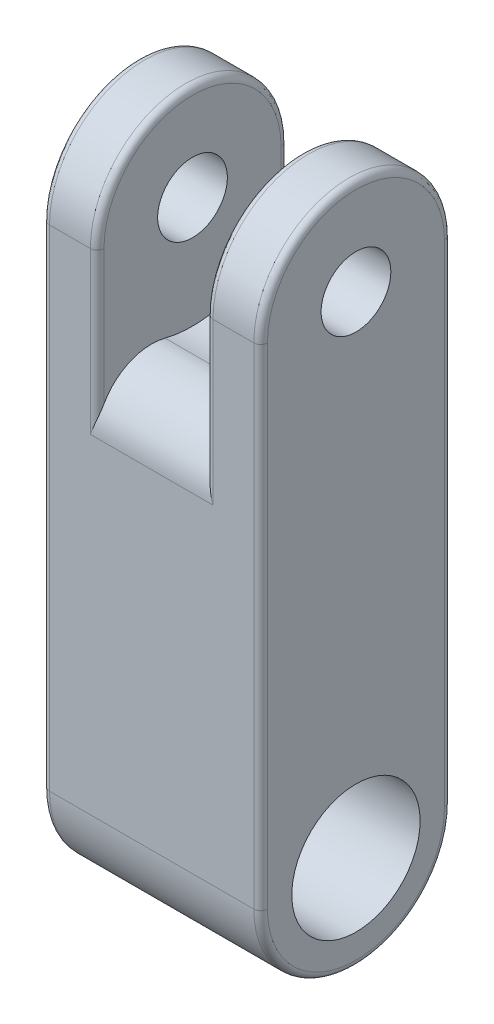
ISO-10303-21;
HEADER;
FILE_DESCRIPTION(('STEP AP214'),'2;1');
FILE_NAME('part.step','',(''),(''),'','','');
FILE_SCHEMA(('AUTOMOTIVE_DESIGN { 1 0 10303 214 1 1 1 1 }'));
ENDSEC;
DATA;
#1=APPLICATION_CONTEXT('core data for automotive mechanical design processes');
#2=APPLICATION_PROTOCOL_DEFINITION('international standard','automotive_design',2000,#1);
#3=PRODUCT_CONTEXT('',#1,'mechanical');
#4=PRODUCT('Part','Part','',(#3));
#5=PRODUCT_RELATED_PRODUCT_CATEGORY('part','',(#4));
#6=PRODUCT_DEFINITION_FORMATION('','',#4);
#7=PRODUCT_DEFINITION_CONTEXT('part definition',#1,'design');
#8=PRODUCT_DEFINITION('design','',#6,#7);
#9=PRODUCT_DEFINITION_SHAPE('','',#8);
#10=(LENGTH_UNIT() NAMED_UNIT(*) SI_UNIT(.MILLI.,.METRE.));
#11=(NAMED_UNIT(*) PLANE_ANGLE_UNIT() SI_UNIT($,.RADIAN.));
#12=(NAMED_UNIT(*) SI_UNIT($,.STERADIAN.) SOLID_ANGLE_UNIT());
#13=UNCERTAINTY_MEASURE_WITH_UNIT(LENGTH_MEASURE(1.E-05),#10,'distance_accuracy_value','');
#14=(GEOMETRIC_REPRESENTATION_CONTEXT(3) GLOBAL_UNCERTAINTY_ASSIGNED_CONTEXT((#13)) GLOBAL_UNIT_ASSIGNED_CONTEXT((#10,
#11,#12)) REPRESENTATION_CONTEXT('',''));
#15=CARTESIAN_POINT('',(0.,0.,0.));
#16=DIRECTION('',(0.,0.,1.));
#17=DIRECTION('',(1.,0.,0.));
#18=AXIS2_PLACEMENT_3D('',#15,#16,#17);
#19=CARTESIAN_POINT('',(6.35,28.575,-5.55625));
#20=DIRECTION('',(0.,0.,1.));
#21=DIRECTION('',(0.,-1.,0.));
#22=AXIS2_PLACEMENT_3D('',#19,#20,#21);
#23=PLANE('',#22);
#24=DIRECTION('',(-1.,0.,0.));
#25=VECTOR('',#24,1.);
#26=CARTESIAN_POINT('',(6.35,28.575,-5.55625));
#27=LINE('',#26,#25);
#28=CARTESIAN_POINT('',(-3.571875,28.575,-5.55625));
#29=VERTEX_POINT('',#28);
#30=CARTESIAN_POINT('',(-5.953125,28.575,-5.55625));
#31=VERTEX_POINT('',#30);
#32=EDGE_CURVE('E392',#29,#31,#27,.T.);
#33=ORIENTED_EDGE('',*,*,#32,.F.);
#34=DIRECTION('',(0.,1.,0.));
#35=VECTOR('',#34,1.);
#36=CARTESIAN_POINT('',(-3.571875,19.197619052342,-5.55625));
#37=LINE('',#36,#35);
#38=CARTESIAN_POINT('',(-3.571875,19.197619052342,-5.55625));
#39=VERTEX_POINT('',#38);
#40=EDGE_CURVE('E222',#29,#39,#37,.F.);
#41=ORIENTED_EDGE('',*,*,#40,.T.);
#42=DIRECTION('',(1.,0.,0.));
#43=VECTOR('',#42,1.);
#44=CARTESIAN_POINT('',(6.35,19.197619052342,-5.55625));
#45=LINE('',#44,#43);
#46=CARTESIAN_POINT('',(3.571875,19.197619052342,-5.55625));
#47=VERTEX_POINT('',#46);
#48=EDGE_CURVE('E182',#39,#47,#45,.T.);
#49=ORIENTED_EDGE('',*,*,#48,.T.);
#50=DIRECTION('',(0.,1.,0.));
#51=VECTOR('',#50,1.);
#52=CARTESIAN_POINT('',(3.571875,28.575,-5.55625));
#53=LINE('',#52,#51);
#54=CARTESIAN_POINT('',(3.571875,28.575,-5.55625));
#55=VERTEX_POINT('',#54);
#56=EDGE_CURVE('E223',#47,#55,#53,.T.);
#57=ORIENTED_EDGE('',*,*,#56,.T.);
#58=CARTESIAN_POINT('',(5.953125,28.575,-5.55625));
#59=VERTEX_POINT('',#58);
#60=EDGE_CURVE('E391',#59,#55,#27,.T.);
#61=ORIENTED_EDGE('',*,*,#60,.F.);
#62=DIRECTION('',(0.,1.,0.));
#63=VECTOR('',#62,1.);
#64=CARTESIAN_POINT('',(5.953125,0.,-5.55625));
#65=LINE('',#64,#63);
#66=CARTESIAN_POINT('',(5.953125,0.,-5.55625));
#67=VERTEX_POINT('',#66);
#68=EDGE_CURVE('E218',#59,#67,#65,.F.);
#69=ORIENTED_EDGE('',*,*,#68,.T.);
#70=DIRECTION('',(-1.,0.,0.));
#71=VECTOR('',#70,1.);
#72=CARTESIAN_POINT('',(6.35,0.,-5.55625));
#73=LINE('',#72,#71);
#74=CARTESIAN_POINT('',(-5.953125,0.,-5.55625));
#75=VERTEX_POINT('',#74);
#76=EDGE_CURVE('E387',#67,#75,#73,.T.);
#77=ORIENTED_EDGE('',*,*,#76,.T.);
#78=DIRECTION('',(0.,1.,0.));
#79=VECTOR('',#78,1.);
#80=CARTESIAN_POINT('',(-5.953125,28.575,-5.55625));
#81=LINE('',#80,#79);
#82=EDGE_CURVE('E213',#75,#31,#81,.T.);
#83=ORIENTED_EDGE('',*,*,#82,.T.);
#84=EDGE_LOOP('',(#33,#41,#49,#57,#61,#69,#77,#83));
#85=FACE_BOUND('',#84,.T.);
#86=ADVANCED_FACE('F41',(#85),#23,.F.);
#87=CARTESIAN_POINT('',(6.35,28.575,0.));
#88=DIRECTION('',(-1.,0.,0.));
#89=DIRECTION('',(0.,0.,1.));
#90=AXIS2_PLACEMENT_3D('',#87,#88,#89);
#91=CYLINDRICAL_SURFACE('',#90,5.55625);
#92=DIRECTION('',(-1.,0.,0.));
#93=VECTOR('',#92,1.);
#94=CARTESIAN_POINT('',(6.35,28.575,5.55625));
#95=LINE('',#94,#93);
#96=CARTESIAN_POINT('',(-3.571875,28.575,5.55625));
#97=VERTEX_POINT('',#96);
#98=CARTESIAN_POINT('',(-5.953125,28.575,5.55625));
#99=VERTEX_POINT('',#98);
#100=EDGE_CURVE('E423',#97,#99,#95,.T.);
#101=ORIENTED_EDGE('',*,*,#100,.F.);
#102=CARTESIAN_POINT('',(-3.571875,28.575,0.));
#103=DIRECTION('',(1.,0.,0.));
#104=DIRECTION('',(0.,0.,-1.));
#105=AXIS2_PLACEMENT_3D('',#102,#103,#104);
#106=CIRCLE('',#105,5.55625);
#107=EDGE_CURVE('E262',#97,#29,#106,.F.);
#108=ORIENTED_EDGE('',*,*,#107,.T.);
#109=ORIENTED_EDGE('',*,*,#32,.T.);
#110=CARTESIAN_POINT('',(-5.953125,28.575,0.));
#111=DIRECTION('',(1.,0.,0.));
#112=DIRECTION('',(0.,0.,-1.));
#113=AXIS2_PLACEMENT_3D('',#110,#111,#112);
#114=CIRCLE('',#113,5.55625);
#115=EDGE_CURVE('E265',#31,#99,#114,.T.);
#116=ORIENTED_EDGE('',*,*,#115,.T.);
#117=EDGE_LOOP('',(#101,#108,#109,#116));
#118=FACE_BOUND('',#117,.T.);
#119=ADVANCED_FACE('F356',(#118),#91,.T.);
#120=CARTESIAN_POINT('',(6.35,0.,5.55625));
#121=DIRECTION('',(0.,0.,-1.));
#122=DIRECTION('',(-1.,0.,0.));
#123=AXIS2_PLACEMENT_3D('',#120,#121,#122);
#124=PLANE('',#123);
#125=DIRECTION('',(1.,0.,0.));
#126=VECTOR('',#125,1.);
#127=CARTESIAN_POINT('',(6.35,19.197619052342,5.55625));
#128=LINE('',#127,#126);
#129=CARTESIAN_POINT('',(3.571875,19.197619052342,5.55625));
#130=VERTEX_POINT('',#129);
#131=CARTESIAN_POINT('',(-3.571875,19.197619052342,5.55625));
#132=VERTEX_POINT('',#131);
#133=EDGE_CURVE('E199',#130,#132,#128,.F.);
#134=ORIENTED_EDGE('',*,*,#133,.T.);
#135=DIRECTION('',(0.,-1.,0.));
#136=VECTOR('',#135,1.);
#137=CARTESIAN_POINT('',(-3.571875,28.575,5.55625));
#138=LINE('',#137,#136);
#139=EDGE_CURVE('E234',#132,#97,#138,.F.);
#140=ORIENTED_EDGE('',*,*,#139,.T.);
#141=ORIENTED_EDGE('',*,*,#100,.T.);
#142=DIRECTION('',(0.,-1.,0.));
#143=VECTOR('',#142,1.);
#144=CARTESIAN_POINT('',(-5.953125,0.,5.55625));
#145=LINE('',#144,#143);
#146=CARTESIAN_POINT('',(-5.953125,0.,5.55625));
#147=VERTEX_POINT('',#146);
#148=EDGE_CURVE('E227',#99,#147,#145,.T.);
#149=ORIENTED_EDGE('',*,*,#148,.T.);
#150=DIRECTION('',(-1.,0.,0.));
#151=VECTOR('',#150,1.);
#152=CARTESIAN_POINT('',(6.35,0.,5.55625));
#153=LINE('',#152,#151);
#154=CARTESIAN_POINT('',(5.953125,0.,5.55625));
#155=VERTEX_POINT('',#154);
#156=EDGE_CURVE('E416',#155,#147,#153,.T.);
#157=ORIENTED_EDGE('',*,*,#156,.F.);
#158=DIRECTION('',(0.,-1.,0.));
#159=VECTOR('',#158,1.);
#160=CARTESIAN_POINT('',(5.953125,28.575,5.55625));
#161=LINE('',#160,#159);
#162=CARTESIAN_POINT('',(5.953125,28.575,5.55625));
#163=VERTEX_POINT('',#162);
#164=EDGE_CURVE('E230',#155,#163,#161,.F.);
#165=ORIENTED_EDGE('',*,*,#164,.T.);
#166=CARTESIAN_POINT('',(3.571875,28.575,5.55625));
#167=VERTEX_POINT('',#166);
#168=EDGE_CURVE('E422',#163,#167,#95,.T.);
#169=ORIENTED_EDGE('',*,*,#168,.T.);
#170=DIRECTION('',(0.,-1.,0.));
#171=VECTOR('',#170,1.);
#172=CARTESIAN_POINT('',(3.571875,0.,5.55625));
#173=LINE('',#172,#171);
#174=EDGE_CURVE('E233',#167,#130,#173,.T.);
#175=ORIENTED_EDGE('',*,*,#174,.T.);
#176=EDGE_LOOP('',(#134,#140,#141,#149,#157,#165,#169,#175));
#177=FACE_BOUND('',#176,.T.);
#178=ADVANCED_FACE('F362',(#177),#124,.F.);
#179=CARTESIAN_POINT('',(6.35,28.575,0.));
#180=DIRECTION('',(-1.,0.,0.));
#181=DIRECTION('',(0.,0.,1.));
#182=AXIS2_PLACEMENT_3D('',#179,#180,#181);
#183=CYLINDRICAL_SURFACE('',#182,2.032);
#184=CARTESIAN_POINT('',(-6.35,28.575,0.));
#185=DIRECTION('',(1.,0.,0.));
#186=DIRECTION('',(0.,0.,-1.));
#187=AXIS2_PLACEMENT_3D('',#184,#185,#186);
#188=CIRCLE('',#187,2.032);
#189=CARTESIAN_POINT('',(-6.35,28.575,-2.032));
#190=VERTEX_POINT('',#189);
#191=EDGE_CURVE('E405',#190,#190,#188,.T.);
#192=ORIENTED_EDGE('',*,*,#191,.F.);
#193=EDGE_LOOP('',(#192));
#194=FACE_BOUND('',#193,.T.);
#195=CARTESIAN_POINT('',(-3.175,28.575,0.));
#196=DIRECTION('',(1.,0.,0.));
#197=DIRECTION('',(0.,0.,-1.));
#198=AXIS2_PLACEMENT_3D('',#195,#196,#197);
#199=CIRCLE('',#198,2.032);
#200=CARTESIAN_POINT('',(-3.175,28.575,-2.032));
#201=VERTEX_POINT('',#200);
#202=EDGE_CURVE('E399',#201,#201,#199,.T.);
#203=ORIENTED_EDGE('',*,*,#202,.T.);
#204=EDGE_LOOP('',(#203));
#205=FACE_BOUND('',#204,.T.);
#206=ADVANCED_FACE('F481',(#194,#205),#183,.F.);
#207=CARTESIAN_POINT('',(6.35,0.,0.));
#208=DIRECTION('',(1.,0.,0.));
#209=DIRECTION('',(0.,0.,-1.));
#210=AXIS2_PLACEMENT_3D('',#207,#208,#209);
#211=PLANE('',#210);
#212=CARTESIAN_POINT('',(6.35,0.,0.));
#213=DIRECTION('',(1.,0.,0.));
#214=DIRECTION('',(0.,0.,-1.));
#215=AXIS2_PLACEMENT_3D('',#212,#213,#214);
#216=CIRCLE('',#215,5.159375);
#217=CARTESIAN_POINT('',(6.35,0.,5.159375));
#218=VERTEX_POINT('',#217);
#219=CARTESIAN_POINT('',(6.35,0.,-5.159375));
#220=VERTEX_POINT('',#219);
#221=EDGE_CURVE('E246',#218,#220,#216,.T.);
#222=ORIENTED_EDGE('',*,*,#221,.T.);
#223=DIRECTION('',(0.,1.,0.));
#224=VECTOR('',#223,1.);
#225=CARTESIAN_POINT('',(6.35,28.575,-5.159375));
#226=LINE('',#225,#224);
#227=CARTESIAN_POINT('',(6.35,28.575,-5.159375));
#228=VERTEX_POINT('',#227);
#229=EDGE_CURVE('E247',#220,#228,#226,.T.);
#230=ORIENTED_EDGE('',*,*,#229,.T.);
#231=CARTESIAN_POINT('',(6.35,28.575,0.));
#232=DIRECTION('',(1.,0.,0.));
#233=DIRECTION('',(0.,0.,-1.));
#234=AXIS2_PLACEMENT_3D('',#231,#232,#233);
#235=CIRCLE('',#234,5.159375);
#236=CARTESIAN_POINT('',(6.35,28.575,5.159375));
#237=VERTEX_POINT('',#236);
#238=EDGE_CURVE('E245',#228,#237,#235,.T.);
#239=ORIENTED_EDGE('',*,*,#238,.T.);
#240=DIRECTION('',(0.,-1.,0.));
#241=VECTOR('',#240,1.);
#242=CARTESIAN_POINT('',(6.35,0.,5.159375));
#243=LINE('',#242,#241);
#244=EDGE_CURVE('E242',#237,#218,#243,.T.);
#245=ORIENTED_EDGE('',*,*,#244,.T.);
#246=EDGE_LOOP('',(#222,#230,#239,#245));
#247=FACE_BOUND('',#246,.T.);
#248=CARTESIAN_POINT('',(6.35,0.,0.));
#249=DIRECTION('',(1.,0.,0.));
#250=DIRECTION('',(0.,0.,-1.));
#251=AXIS2_PLACEMENT_3D('',#248,#249,#250);
#252=CIRCLE('',#251,3.73949769354121);
#253=CARTESIAN_POINT('',(6.35,0.,-3.73949769354121));
#254=VERTEX_POINT('',#253);
#255=EDGE_CURVE('E414',#254,#254,#252,.T.);
#256=ORIENTED_EDGE('',*,*,#255,.F.);
#257=EDGE_LOOP('',(#256));
#258=FACE_BOUND('',#257,.T.);
#259=CARTESIAN_POINT('',(6.35,28.575,0.));
#260=DIRECTION('',(1.,0.,0.));
#261=DIRECTION('',(0.,0.,-1.));
#262=AXIS2_PLACEMENT_3D('',#259,#260,#261);
#263=CIRCLE('',#262,2.032);
#264=CARTESIAN_POINT('',(6.35,28.575,-2.032));
#265=VERTEX_POINT('',#264);
#266=EDGE_CURVE('E407',#265,#265,#263,.T.);
#267=ORIENTED_EDGE('',*,*,#266,.F.);
#268=EDGE_LOOP('',(#267));
#269=FACE_BOUND('',#268,.T.);
#270=ADVANCED_FACE('F385',(#247,#258,#269),#211,.T.);
#271=CARTESIAN_POINT('',(-6.35,0.,0.));
#272=DIRECTION('',(1.,0.,0.));
#273=DIRECTION('',(0.,0.,-1.));
#274=AXIS2_PLACEMENT_3D('',#271,#272,#273);
#275=PLANE('',#274);
#276=CARTESIAN_POINT('',(-6.35,28.575,0.));
#277=DIRECTION('',(1.,0.,0.));
#278=DIRECTION('',(0.,0.,-1.));
#279=AXIS2_PLACEMENT_3D('',#276,#277,#278);
#280=CIRCLE('',#279,5.159375);
#281=CARTESIAN_POINT('',(-6.35,28.575,5.159375));
#282=VERTEX_POINT('',#281);
#283=CARTESIAN_POINT('',(-6.35,28.575,-5.159375));
#284=VERTEX_POINT('',#283);
#285=EDGE_CURVE('E253',#282,#284,#280,.F.);
#286=ORIENTED_EDGE('',*,*,#285,.T.);
#287=DIRECTION('',(0.,1.,0.));
#288=VECTOR('',#287,1.);
#289=CARTESIAN_POINT('',(-6.35,0.,-5.159375));
#290=LINE('',#289,#288);
#291=CARTESIAN_POINT('',(-6.35,0.,-5.159375));
#292=VERTEX_POINT('',#291);
#293=EDGE_CURVE('E258',#284,#292,#290,.F.);
#294=ORIENTED_EDGE('',*,*,#293,.T.);
#295=CARTESIAN_POINT('',(-6.35,0.,0.));
#296=DIRECTION('',(1.,0.,0.));
#297=DIRECTION('',(0.,0.,-1.));
#298=AXIS2_PLACEMENT_3D('',#295,#296,#297);
#299=CIRCLE('',#298,5.159375);
#300=CARTESIAN_POINT('',(-6.35,0.,5.159375));
#301=VERTEX_POINT('',#300);
#302=EDGE_CURVE('E63',#292,#301,#299,.F.);
#303=ORIENTED_EDGE('',*,*,#302,.T.);
#304=DIRECTION('',(0.,-1.,0.));
#305=VECTOR('',#304,1.);
#306=CARTESIAN_POINT('',(-6.35,0.,5.159375));
#307=LINE('',#306,#305);
#308=EDGE_CURVE('E260',#301,#282,#307,.F.);
#309=ORIENTED_EDGE('',*,*,#308,.T.);
#310=EDGE_LOOP('',(#286,#294,#303,#309));
#311=FACE_BOUND('',#310,.T.);
#312=CARTESIAN_POINT('',(-6.35,0.,0.));
#313=DIRECTION('',(1.,0.,0.));
#314=DIRECTION('',(0.,0.,-1.));
#315=AXIS2_PLACEMENT_3D('',#312,#313,#314);
#316=CIRCLE('',#315,3.73949769354121);
#317=CARTESIAN_POINT('',(-6.35,0.,-3.73949769354121));
#318=VERTEX_POINT('',#317);
#319=EDGE_CURVE('E411',#318,#318,#316,.T.);
#320=ORIENTED_EDGE('',*,*,#319,.T.);
#321=EDGE_LOOP('',(#320));
#322=FACE_BOUND('',#321,.T.);
#323=ORIENTED_EDGE('',*,*,#191,.T.);
#324=EDGE_LOOP('',(#323));
#325=FACE_BOUND('',#324,.T.);
#326=ADVANCED_FACE('F373',(#311,#322,#325),#275,.F.);
#327=CARTESIAN_POINT('',(6.35,0.,0.));
#328=DIRECTION('',(-1.,0.,0.));
#329=DIRECTION('',(0.,0.,1.));
#330=AXIS2_PLACEMENT_3D('',#327,#328,#329);
#331=CYLINDRICAL_SURFACE('',#330,5.55625);
#332=ORIENTED_EDGE('',*,*,#76,.F.);
#333=CARTESIAN_POINT('',(5.953125,0.,0.));
#334=DIRECTION('',(1.,0.,0.));
#335=DIRECTION('',(0.,0.,-1.));
#336=AXIS2_PLACEMENT_3D('',#333,#334,#335);
#337=CIRCLE('',#336,5.55625);
#338=EDGE_CURVE('E254',#67,#155,#337,.F.);
#339=ORIENTED_EDGE('',*,*,#338,.T.);
#340=ORIENTED_EDGE('',*,*,#156,.T.);
#341=CARTESIAN_POINT('',(-5.953125,0.,0.));
#342=DIRECTION('',(1.,0.,0.));
#343=DIRECTION('',(0.,0.,-1.));
#344=AXIS2_PLACEMENT_3D('',#341,#342,#343);
#345=CIRCLE('',#344,5.55625);
#346=EDGE_CURVE('E252',#147,#75,#345,.T.);
#347=ORIENTED_EDGE('',*,*,#346,.T.);
#348=EDGE_LOOP('',(#332,#339,#340,#347));
#349=FACE_BOUND('',#348,.T.);
#350=ADVANCED_FACE('F371',(#349),#331,.T.);
#351=ORIENTED_EDGE('',*,*,#60,.T.);
#352=CARTESIAN_POINT('',(3.571875,28.575,0.));
#353=DIRECTION('',(1.,0.,0.));
#354=DIRECTION('',(0.,0.,-1.));
#355=AXIS2_PLACEMENT_3D('',#352,#353,#354);
#356=CIRCLE('',#355,5.55625);
#357=EDGE_CURVE('E266',#55,#167,#356,.T.);
#358=ORIENTED_EDGE('',*,*,#357,.T.);
#359=ORIENTED_EDGE('',*,*,#168,.F.);
#360=CARTESIAN_POINT('',(5.953125,28.575,0.));
#361=DIRECTION('',(1.,0.,0.));
#362=DIRECTION('',(0.,0.,-1.));
#363=AXIS2_PLACEMENT_3D('',#360,#361,#362);
#364=CIRCLE('',#363,5.55625);
#365=EDGE_CURVE('E268',#163,#59,#364,.F.);
#366=ORIENTED_EDGE('',*,*,#365,.T.);
#367=EDGE_LOOP('',(#351,#358,#359,#366));
#368=FACE_BOUND('',#367,.T.);
#369=ADVANCED_FACE('F368',(#368),#91,.T.);
#370=CARTESIAN_POINT('',(6.35,0.,0.));
#371=DIRECTION('',(-1.,0.,0.));
#372=DIRECTION('',(0.,0.,1.));
#373=AXIS2_PLACEMENT_3D('',#370,#371,#372);
#374=CYLINDRICAL_SURFACE('',#373,3.73949769354121);
#375=ORIENTED_EDGE('',*,*,#255,.T.);
#376=EDGE_LOOP('',(#375));
#377=FACE_BOUND('',#376,.T.);
#378=ORIENTED_EDGE('',*,*,#319,.F.);
#379=EDGE_LOOP('',(#378));
#380=FACE_BOUND('',#379,.T.);
#381=ADVANCED_FACE('F378',(#377,#380),#374,.F.);
#382=CARTESIAN_POINT('',(3.175,28.575,0.));
#383=DIRECTION('',(1.,0.,0.));
#384=DIRECTION('',(0.,0.,-1.));
#385=AXIS2_PLACEMENT_3D('',#382,#383,#384);
#386=CIRCLE('',#385,2.032);
#387=CARTESIAN_POINT('',(3.175,28.575,-2.032));
#388=VERTEX_POINT('',#387);
#389=EDGE_CURVE('E195',#388,#388,#386,.T.);
#390=ORIENTED_EDGE('',*,*,#389,.F.);
#391=EDGE_LOOP('',(#390));
#392=FACE_BOUND('',#391,.T.);
#393=ORIENTED_EDGE('',*,*,#266,.T.);
#394=EDGE_LOOP('',(#393));
#395=FACE_BOUND('',#394,.T.);
#396=ADVANCED_FACE('F471',(#392,#395),#183,.F.);
#397=CARTESIAN_POINT('',(-3.175,28.575,0.));
#398=DIRECTION('',(1.,0.,0.));
#399=DIRECTION('',(0.,0.,-1.));
#400=AXIS2_PLACEMENT_3D('',#397,#398,#399);
#401=CYLINDRICAL_SURFACE('',#400,6.5);
#402=CARTESIAN_POINT('',(-3.175,28.575,0.));
#403=DIRECTION('',(1.,0.,0.));
#404=DIRECTION('',(0.,0.,-1.));
#405=AXIS2_PLACEMENT_3D('',#402,#403,#404);
#406=CIRCLE('',#405,6.5);
#407=CARTESIAN_POINT('',(-3.175,22.2749507845191,1.59980620155039));
#408=VERTEX_POINT('',#407);
#409=CARTESIAN_POINT('',(-3.175,22.2749507845191,-1.59980620155039));
#410=VERTEX_POINT('',#409);
#411=EDGE_CURVE('E172',#408,#410,#406,.T.);
#412=ORIENTED_EDGE('',*,*,#411,.F.);
#413=DIRECTION('',(1.,0.,0.));
#414=VECTOR('',#413,1.);
#415=CARTESIAN_POINT('',(-3.175,22.2749507845191,1.59980620155039));
#416=LINE('',#415,#414);
#417=CARTESIAN_POINT('',(3.175,22.2749507845191,1.59980620155039));
#418=VERTEX_POINT('',#417);
#419=EDGE_CURVE('E189',#408,#418,#416,.T.);
#420=ORIENTED_EDGE('',*,*,#419,.T.);
#421=CARTESIAN_POINT('',(3.175,28.575,0.));
#422=DIRECTION('',(1.,0.,0.));
#423=DIRECTION('',(0.,0.,-1.));
#424=AXIS2_PLACEMENT_3D('',#421,#422,#423);
#425=CIRCLE('',#424,6.5);
#426=CARTESIAN_POINT('',(3.175,22.2749507845191,-1.59980620155039));
#427=VERTEX_POINT('',#426);
#428=EDGE_CURVE('E194',#418,#427,#425,.T.);
#429=ORIENTED_EDGE('',*,*,#428,.T.);
#430=DIRECTION('',(1.,0.,0.));
#431=VECTOR('',#430,1.);
#432=CARTESIAN_POINT('',(-3.175,22.2749507845191,-1.59980620155039));
#433=LINE('',#432,#431);
#434=EDGE_CURVE('E192',#427,#410,#433,.F.);
#435=ORIENTED_EDGE('',*,*,#434,.T.);
#436=EDGE_LOOP('',(#412,#420,#429,#435));
#437=FACE_BOUND('',#436,.T.);
#438=ADVANCED_FACE('F187',(#437),#401,.F.);
#439=CARTESIAN_POINT('',(-3.175,28.575,0.));
#440=DIRECTION('',(1.,0.,0.));
#441=DIRECTION('',(0.,0.,-1.));
#442=AXIS2_PLACEMENT_3D('',#439,#440,#441);
#443=PLANE('',#442);
#444=CARTESIAN_POINT('',(-3.175,19.197619052342,-2.38125));
#445=DIRECTION('',(1.,0.,0.));
#446=DIRECTION('',(0.,0.,-1.));
#447=AXIS2_PLACEMENT_3D('',#444,#445,#446);
#448=CIRCLE('',#447,3.175);
#449=CARTESIAN_POINT('',(-3.175,20.734709317868,-5.159375));
#450=VERTEX_POINT('',#449);
#451=EDGE_CURVE('E210',#410,#450,#448,.F.);
#452=ORIENTED_EDGE('',*,*,#451,.T.);
#453=DIRECTION('',(0.,1.,0.));
#454=VECTOR('',#453,1.);
#455=CARTESIAN_POINT('',(-3.175,28.575,-5.159375));
#456=LINE('',#455,#454);
#457=CARTESIAN_POINT('',(-3.175,28.575,-5.159375));
#458=VERTEX_POINT('',#457);
#459=EDGE_CURVE('E215',#450,#458,#456,.T.);
#460=ORIENTED_EDGE('',*,*,#459,.T.);
#461=CARTESIAN_POINT('',(-3.175,28.575,0.));
#462=DIRECTION('',(1.,0.,0.));
#463=DIRECTION('',(0.,0.,-1.));
#464=AXIS2_PLACEMENT_3D('',#461,#462,#463);
#465=CIRCLE('',#464,5.159375);
#466=CARTESIAN_POINT('',(-3.175,28.575,5.159375));
#467=VERTEX_POINT('',#466);
#468=EDGE_CURVE('E209',#458,#467,#465,.T.);
#469=ORIENTED_EDGE('',*,*,#468,.T.);
#470=DIRECTION('',(0.,-1.,0.));
#471=VECTOR('',#470,1.);
#472=CARTESIAN_POINT('',(-3.175,19.197619052342,5.159375));
#473=LINE('',#472,#471);
#474=CARTESIAN_POINT('',(-3.175,20.734709317868,5.159375));
#475=VERTEX_POINT('',#474);
#476=EDGE_CURVE('E180',#467,#475,#473,.T.);
#477=ORIENTED_EDGE('',*,*,#476,.T.);
#478=CARTESIAN_POINT('',(-3.175,19.197619052342,2.38125));
#479=DIRECTION('',(1.,0.,0.));
#480=DIRECTION('',(0.,0.,-1.));
#481=AXIS2_PLACEMENT_3D('',#478,#479,#480);
#482=CIRCLE('',#481,3.175);
#483=EDGE_CURVE('E169',#475,#408,#482,.F.);
#484=ORIENTED_EDGE('',*,*,#483,.T.);
#485=ORIENTED_EDGE('',*,*,#411,.T.);
#486=EDGE_LOOP('',(#452,#460,#469,#477,#484,#485));
#487=FACE_BOUND('',#486,.T.);
#488=ORIENTED_EDGE('',*,*,#202,.F.);
#489=EDGE_LOOP('',(#488));
#490=FACE_BOUND('',#489,.T.);
#491=ADVANCED_FACE('F175',(#487,#490),#443,.T.);
#492=CARTESIAN_POINT('',(3.175,28.575,0.));
#493=DIRECTION('',(1.,0.,0.));
#494=DIRECTION('',(0.,0.,-1.));
#495=AXIS2_PLACEMENT_3D('',#492,#493,#494);
#496=PLANE('',#495);
#497=ORIENTED_EDGE('',*,*,#389,.T.);
#498=EDGE_LOOP('',(#497));
#499=FACE_BOUND('',#498,.T.);
#500=CARTESIAN_POINT('',(3.175,28.575,0.));
#501=DIRECTION('',(1.,0.,0.));
#502=DIRECTION('',(0.,0.,-1.));
#503=AXIS2_PLACEMENT_3D('',#500,#501,#502);
#504=CIRCLE('',#503,5.159375);
#505=CARTESIAN_POINT('',(3.175,28.575,5.159375));
#506=VERTEX_POINT('',#505);
#507=CARTESIAN_POINT('',(3.175,28.575,-5.159375));
#508=VERTEX_POINT('',#507);
#509=EDGE_CURVE('E236',#506,#508,#504,.F.);
#510=ORIENTED_EDGE('',*,*,#509,.T.);
#511=DIRECTION('',(0.,1.,0.));
#512=VECTOR('',#511,1.);
#513=CARTESIAN_POINT('',(3.175,28.575,-5.159375));
#514=LINE('',#513,#512);
#515=CARTESIAN_POINT('',(3.175,20.734709317868,-5.159375));
#516=VERTEX_POINT('',#515);
#517=EDGE_CURVE('E239',#508,#516,#514,.F.);
#518=ORIENTED_EDGE('',*,*,#517,.T.);
#519=CARTESIAN_POINT('',(3.175,19.197619052342,-2.38125));
#520=DIRECTION('',(1.,0.,0.));
#521=DIRECTION('',(0.,0.,-1.));
#522=AXIS2_PLACEMENT_3D('',#519,#520,#521);
#523=CIRCLE('',#522,3.175);
#524=EDGE_CURVE('E204',#516,#427,#523,.T.);
#525=ORIENTED_EDGE('',*,*,#524,.T.);
#526=ORIENTED_EDGE('',*,*,#428,.F.);
#527=CARTESIAN_POINT('',(3.175,19.197619052342,2.38125));
#528=DIRECTION('',(1.,0.,0.));
#529=DIRECTION('',(0.,0.,-1.));
#530=AXIS2_PLACEMENT_3D('',#527,#528,#529);
#531=CIRCLE('',#530,3.175);
#532=CARTESIAN_POINT('',(3.175,20.734709317868,5.159375));
#533=VERTEX_POINT('',#532);
#534=EDGE_CURVE('E185',#418,#533,#531,.T.);
#535=ORIENTED_EDGE('',*,*,#534,.T.);
#536=DIRECTION('',(0.,-1.,0.));
#537=VECTOR('',#536,1.);
#538=CARTESIAN_POINT('',(3.175,28.575,5.159375));
#539=LINE('',#538,#537);
#540=EDGE_CURVE('E238',#533,#506,#539,.F.);
#541=ORIENTED_EDGE('',*,*,#540,.T.);
#542=EDGE_LOOP('',(#510,#518,#525,#526,#535,#541));
#543=FACE_BOUND('',#542,.T.);
#544=ADVANCED_FACE('F518',(#499,#543),#496,.F.);
#545=CARTESIAN_POINT('',(-3.175,19.197619052342,2.38125));
#546=DIRECTION('',(1.,0.,0.));
#547=DIRECTION('',(0.,0.,-1.));
#548=AXIS2_PLACEMENT_3D('',#545,#546,#547);
#549=CYLINDRICAL_SURFACE('',#548,3.175);
#550=ORIENTED_EDGE('',*,*,#534,.F.);
#551=ORIENTED_EDGE('',*,*,#419,.F.);
#552=ORIENTED_EDGE('',*,*,#483,.F.);
#553=CARTESIAN_POINT('',(-3.175,20.734709317868,5.159375));
#554=CARTESIAN_POINT('',(-3.17500359114712,20.7117211207457,5.17209452048544));
#555=CARTESIAN_POINT('',(-3.17561097911369,20.688582164194,5.18452366027426));
#556=CARTESIAN_POINT('',(-3.1778979230823,20.6420543200317,5.20877880065971));
#557=CARTESIAN_POINT('',(-3.17957701509329,20.618665544886,5.22060505988008));
#558=CARTESIAN_POINT('',(-3.18601002936707,20.548278226251,5.25510992399833));
#559=CARTESIAN_POINT('',(-3.19216093925411,20.5009541982955,5.2768723691588));
#560=CARTESIAN_POINT('',(-3.20733742313345,20.4059292399398,5.31779170237638));
#561=CARTESIAN_POINT('',(-3.21634977547314,20.3582310081934,5.33696000716771));
#562=CARTESIAN_POINT('',(-3.23665767034381,20.2623652199081,5.37283191645644));
#563=CARTESIAN_POINT('',(-3.24795489003361,20.2141973435006,5.38953369477979));
#564=CARTESIAN_POINT('',(-3.28002223175274,20.0870942775426,5.43023296364362));
#565=CARTESIAN_POINT('',(-3.30227893692873,20.0078776601795,5.45220510110484));
#566=CARTESIAN_POINT('',(-3.34995559933418,19.8489247437015,5.48980376346474));
#567=CARTESIAN_POINT('',(-3.37537685026634,19.7691882447596,5.50542768193538));
#568=CARTESIAN_POINT('',(-3.45461368035661,19.529365847053,5.54301358917141));
#569=CARTESIAN_POINT('',(-3.51140771557323,19.3686480881842,5.55569569906621));
#570=CARTESIAN_POINT('',(-3.56937075964604,19.2047021818465,5.55624406882298));
#571=CARTESIAN_POINT('',(-3.57062292192902,19.2011605344104,5.55624999395817));
#572=CARTESIAN_POINT('',(-3.571875,19.197619052342,5.55625));
#573=B_SPLINE_CURVE_WITH_KNOTS('',3,(#553,#554,#555,#556,#557,#558,#559,#560,#561,#562,#563,
#564,#565,#566,#567,#568,#569,#570,#571,#572),.UNSPECIFIED.,.F.,.F.,(4,2,2,2,2,2,2,2,2,4),(0.,
0.0787947458337118,0.157555400837244,0.314719852426702,0.471168423244263,0.62773225136772,
0.882848289439274,1.13806896651462,1.6484491511163,1.65971859281112),.UNSPECIFIED.);
#574=EDGE_CURVE('E279',#475,#132,#573,.T.);
#575=ORIENTED_EDGE('',*,*,#574,.T.);
#576=ORIENTED_EDGE('',*,*,#133,.F.);
#577=CARTESIAN_POINT('',(3.175,20.734709317868,5.159375));
#578=CARTESIAN_POINT('',(3.17500359114712,20.7117211207457,5.17209452048544));
#579=CARTESIAN_POINT('',(3.17561097911369,20.688582164194,5.18452366027426));
#580=CARTESIAN_POINT('',(3.1778979230823,20.6420543200317,5.20877880065971));
#581=CARTESIAN_POINT('',(3.17957701509329,20.618665544886,5.22060505988008));
#582=CARTESIAN_POINT('',(3.18601002936707,20.548278226251,5.25510992399833));
#583=CARTESIAN_POINT('',(3.19216093925411,20.5009541982955,5.2768723691588));
#584=CARTESIAN_POINT('',(3.20733742313345,20.4059292399398,5.31779170237638));
#585=CARTESIAN_POINT('',(3.21634977547314,20.3582310081934,5.33696000716771));
#586=CARTESIAN_POINT('',(3.23665767034381,20.2623652199081,5.37283191645644));
#587=CARTESIAN_POINT('',(3.24795489003361,20.2141973435006,5.38953369477979));
#588=CARTESIAN_POINT('',(3.28002223175274,20.0870942775426,5.43023296364362));
#589=CARTESIAN_POINT('',(3.30227893692873,20.0078776601795,5.45220510110484));
#590=CARTESIAN_POINT('',(3.34995559933418,19.8489247437015,5.48980376346474));
#591=CARTESIAN_POINT('',(3.37537685026634,19.7691882447596,5.50542768193538));
#592=CARTESIAN_POINT('',(3.45461368035661,19.529365847053,5.54301358917141));
#593=CARTESIAN_POINT('',(3.51140771557323,19.3686480881842,5.55569569906621));
#594=CARTESIAN_POINT('',(3.56937075964604,19.2047021818465,5.55624406882298));
#595=CARTESIAN_POINT('',(3.57062292192902,19.2011605344104,5.55624999395817));
#596=CARTESIAN_POINT('',(3.571875,19.197619052342,5.55625));
#597=B_SPLINE_CURVE_WITH_KNOTS('',3,(#577,#578,#579,#580,#581,#582,#583,#584,#585,#586,#587,
#588,#589,#590,#591,#592,#593,#594,#595,#596),.UNSPECIFIED.,.F.,.F.,(4,2,2,2,2,2,2,2,2,4),(0.,
0.0787947458337118,0.157555400837244,0.314719852426702,0.471168423244263,0.62773225136772,
0.882848289439274,1.13806896651462,1.6484491511163,1.65971859281112),.UNSPECIFIED.);
#598=EDGE_CURVE('E11',#130,#533,#597,.F.);
#599=ORIENTED_EDGE('',*,*,#598,.T.);
#600=EDGE_LOOP('',(#550,#551,#552,#575,#576,#599));
#601=FACE_BOUND('',#600,.T.);
#602=ADVANCED_FACE('F196',(#601),#549,.T.);
#603=CARTESIAN_POINT('',(-3.175,19.197619052342,-2.38125));
#604=DIRECTION('',(1.,0.,0.));
#605=DIRECTION('',(0.,0.,-1.));
#606=AXIS2_PLACEMENT_3D('',#603,#604,#605);
#607=CYLINDRICAL_SURFACE('',#606,3.175);
#608=ORIENTED_EDGE('',*,*,#451,.F.);
#609=ORIENTED_EDGE('',*,*,#434,.F.);
#610=ORIENTED_EDGE('',*,*,#524,.F.);
#611=CARTESIAN_POINT('',(3.175,20.734709317868,-5.159375));
#612=CARTESIAN_POINT('',(3.17500359114712,20.7117211207457,-5.17209452048544));
#613=CARTESIAN_POINT('',(3.17561097911369,20.688582164194,-5.18452366027427));
#614=CARTESIAN_POINT('',(3.1778979230823,20.6420543200317,-5.20877880065972));
#615=CARTESIAN_POINT('',(3.17957701509329,20.618665544886,-5.22060505988008));
#616=CARTESIAN_POINT('',(3.18601002936707,20.548278226251,-5.25510992399834));
#617=CARTESIAN_POINT('',(3.19216093925411,20.5009541982955,-5.27687236915881));
#618=CARTESIAN_POINT('',(3.20733742313345,20.4059292399398,-5.31779170237639));
#619=CARTESIAN_POINT('',(3.21634977547315,20.3582310081934,-5.33696000716771));
#620=CARTESIAN_POINT('',(3.23665767034381,20.2623652199081,-5.37283191645644));
#621=CARTESIAN_POINT('',(3.24795489003361,20.2141973435006,-5.3895336947798));
#622=CARTESIAN_POINT('',(3.28002223175274,20.0870942775426,-5.43023296364362));
#623=CARTESIAN_POINT('',(3.30227893692874,20.0078776601795,-5.45220510110484));
#624=CARTESIAN_POINT('',(3.34995559933418,19.8489247437015,-5.48980376346474));
#625=CARTESIAN_POINT('',(3.37537685026631,19.7691882447596,-5.50542768193538));
#626=CARTESIAN_POINT('',(3.45461368035666,19.529365847053,-5.54301358917141));
#627=CARTESIAN_POINT('',(3.51140771557349,19.3686480881843,-5.55569569906622));
#628=CARTESIAN_POINT('',(3.56937075964605,19.2047021818465,-5.55624406882298));
#629=CARTESIAN_POINT('',(3.57062292192902,19.2011605344104,-5.55624999395817));
#630=CARTESIAN_POINT('',(3.571875,19.197619052342,-5.55625));
#631=B_SPLINE_CURVE_WITH_KNOTS('',3,(#611,#612,#613,#614,#615,#616,#617,#618,#619,#620,#621,
#622,#623,#624,#625,#626,#627,#628,#629,#630),.UNSPECIFIED.,.F.,.F.,(4,2,2,2,2,2,2,2,2,4),(0.,
0.0787947458337161,0.157555400837255,0.314719852426725,0.47116842324427,0.62773225136772,
0.88284828943927,1.13806896651461,1.6484491511163,1.65971859281112),.UNSPECIFIED.);
#632=EDGE_CURVE('E49',#516,#47,#631,.T.);
#633=ORIENTED_EDGE('',*,*,#632,.T.);
#634=ORIENTED_EDGE('',*,*,#48,.F.);
#635=CARTESIAN_POINT('',(-3.175,20.734709317868,-5.159375));
#636=CARTESIAN_POINT('',(-3.17500359114712,20.7117211207457,-5.17209452048544));
#637=CARTESIAN_POINT('',(-3.17561097911369,20.688582164194,-5.18452366027427));
#638=CARTESIAN_POINT('',(-3.1778979230823,20.6420543200317,-5.20877880065972));
#639=CARTESIAN_POINT('',(-3.17957701509329,20.618665544886,-5.22060505988008));
#640=CARTESIAN_POINT('',(-3.18601002936707,20.548278226251,-5.25510992399834));
#641=CARTESIAN_POINT('',(-3.19216093925411,20.5009541982955,-5.27687236915881));
#642=CARTESIAN_POINT('',(-3.20733742313345,20.4059292399398,-5.31779170237639));
#643=CARTESIAN_POINT('',(-3.21634977547315,20.3582310081934,-5.33696000716771));
#644=CARTESIAN_POINT('',(-3.23665767034381,20.2623652199081,-5.37283191645644));
#645=CARTESIAN_POINT('',(-3.24795489003361,20.2141973435006,-5.3895336947798));
#646=CARTESIAN_POINT('',(-3.28002223175274,20.0870942775426,-5.43023296364362));
#647=CARTESIAN_POINT('',(-3.30227893692874,20.0078776601795,-5.45220510110484));
#648=CARTESIAN_POINT('',(-3.34995559933418,19.8489247437015,-5.48980376346474));
#649=CARTESIAN_POINT('',(-3.37537685026631,19.7691882447596,-5.50542768193538));
#650=CARTESIAN_POINT('',(-3.45461368035666,19.529365847053,-5.54301358917141));
#651=CARTESIAN_POINT('',(-3.51140771557349,19.3686480881843,-5.55569569906622));
#652=CARTESIAN_POINT('',(-3.56937075964605,19.2047021818465,-5.55624406882298));
#653=CARTESIAN_POINT('',(-3.57062292192902,19.2011605344104,-5.55624999395817));
#654=CARTESIAN_POINT('',(-3.571875,19.197619052342,-5.55625));
#655=B_SPLINE_CURVE_WITH_KNOTS('',3,(#635,#636,#637,#638,#639,#640,#641,#642,#643,#644,#645,
#646,#647,#648,#649,#650,#651,#652,#653,#654),.UNSPECIFIED.,.F.,.F.,(4,2,2,2,2,2,2,2,2,4),(0.,
0.0787947458337161,0.157555400837255,0.314719852426725,0.47116842324427,0.62773225136772,
0.88284828943927,1.13806896651461,1.6484491511163,1.65971859281112),.UNSPECIFIED.);
#656=EDGE_CURVE('E269',#39,#450,#655,.F.);
#657=ORIENTED_EDGE('',*,*,#656,.T.);
#658=EDGE_LOOP('',(#608,#609,#610,#633,#634,#657));
#659=FACE_BOUND('',#658,.T.);
#660=ADVANCED_FACE('F288',(#659),#607,.T.);
#661=CARTESIAN_POINT('',(-3.571875,28.575,5.159375));
#662=DIRECTION('',(0.,1.,0.));
#663=DIRECTION('',(0.,0.,1.));
#664=AXIS2_PLACEMENT_3D('',#661,#662,#663);
#665=CYLINDRICAL_SURFACE('',#664,0.396875);
#666=ORIENTED_EDGE('',*,*,#574,.F.);
#667=ORIENTED_EDGE('',*,*,#476,.F.);
#668=CARTESIAN_POINT('',(-3.571875,28.575,5.159375));
#669=DIRECTION('',(0.,1.,0.));
#670=DIRECTION('',(0.,0.,1.));
#671=AXIS2_PLACEMENT_3D('',#668,#669,#670);
#672=CIRCLE('',#671,0.396875);
#673=EDGE_CURVE('E458',#97,#467,#672,.T.);
#674=ORIENTED_EDGE('',*,*,#673,.F.);
#675=ORIENTED_EDGE('',*,*,#139,.F.);
#676=EDGE_LOOP('',(#666,#667,#674,#675));
#677=FACE_BOUND('',#676,.T.);
#678=ADVANCED_FACE('F298',(#677),#665,.T.);
#679=CARTESIAN_POINT('',(-3.571875,28.575,0.));
#680=DIRECTION('',(1.,0.,0.));
#681=DIRECTION('',(0.,0.,-1.));
#682=AXIS2_PLACEMENT_3D('',#679,#680,#681);
#683=TOROIDAL_SURFACE('',#682,5.159375,0.396875);
#684=ORIENTED_EDGE('',*,*,#673,.T.);
#685=ORIENTED_EDGE('',*,*,#468,.F.);
#686=CARTESIAN_POINT('',(-3.571875,28.575,-5.159375));
#687=DIRECTION('',(0.,-1.,0.));
#688=DIRECTION('',(0.,0.,-1.));
#689=AXIS2_PLACEMENT_3D('',#686,#687,#688);
#690=CIRCLE('',#689,0.396875);
#691=EDGE_CURVE('E318',#29,#458,#690,.T.);
#692=ORIENTED_EDGE('',*,*,#691,.F.);
#693=ORIENTED_EDGE('',*,*,#107,.F.);
#694=EDGE_LOOP('',(#684,#685,#692,#693));
#695=FACE_BOUND('',#694,.T.);
#696=ADVANCED_FACE('F291',(#695),#683,.T.);
#697=CARTESIAN_POINT('',(-3.571875,28.575,-5.159375));
#698=DIRECTION('',(0.,-1.,0.));
#699=DIRECTION('',(0.,0.,-1.));
#700=AXIS2_PLACEMENT_3D('',#697,#698,#699);
#701=CYLINDRICAL_SURFACE('',#700,0.396875);
#702=ORIENTED_EDGE('',*,*,#656,.F.);
#703=ORIENTED_EDGE('',*,*,#40,.F.);
#704=ORIENTED_EDGE('',*,*,#691,.T.);
#705=ORIENTED_EDGE('',*,*,#459,.F.);
#706=EDGE_LOOP('',(#702,#703,#704,#705));
#707=FACE_BOUND('',#706,.T.);
#708=ADVANCED_FACE('F286',(#707),#701,.T.);
#709=CARTESIAN_POINT('',(3.571875,0.,5.159375));
#710=DIRECTION('',(0.,-1.,0.));
#711=DIRECTION('',(0.,0.,-1.));
#712=AXIS2_PLACEMENT_3D('',#709,#710,#711);
#713=CYLINDRICAL_SURFACE('',#712,0.396875);
#714=ORIENTED_EDGE('',*,*,#598,.F.);
#715=ORIENTED_EDGE('',*,*,#174,.F.);
#716=CARTESIAN_POINT('',(3.571875,28.575,5.159375));
#717=DIRECTION('',(0.,1.,0.));
#718=DIRECTION('',(0.,0.,1.));
#719=AXIS2_PLACEMENT_3D('',#716,#717,#718);
#720=CIRCLE('',#719,0.396875);
#721=EDGE_CURVE('E453',#506,#167,#720,.T.);
#722=ORIENTED_EDGE('',*,*,#721,.F.);
#723=ORIENTED_EDGE('',*,*,#540,.F.);
#724=EDGE_LOOP('',(#714,#715,#722,#723));
#725=FACE_BOUND('',#724,.T.);
#726=ADVANCED_FACE('F292',(#725),#713,.T.);
#727=CARTESIAN_POINT('',(3.571875,28.575,0.));
#728=DIRECTION('',(1.,0.,0.));
#729=DIRECTION('',(0.,0.,-1.));
#730=AXIS2_PLACEMENT_3D('',#727,#728,#729);
#731=TOROIDAL_SURFACE('',#730,5.159375,0.396875);
#732=ORIENTED_EDGE('',*,*,#721,.T.);
#733=ORIENTED_EDGE('',*,*,#357,.F.);
#734=CARTESIAN_POINT('',(3.571875,28.575,-5.159375));
#735=DIRECTION('',(0.,-1.,0.));
#736=DIRECTION('',(0.,0.,-1.));
#737=AXIS2_PLACEMENT_3D('',#734,#735,#736);
#738=CIRCLE('',#737,0.396875);
#739=EDGE_CURVE('E449',#508,#55,#738,.T.);
#740=ORIENTED_EDGE('',*,*,#739,.F.);
#741=ORIENTED_EDGE('',*,*,#509,.F.);
#742=EDGE_LOOP('',(#732,#733,#740,#741));
#743=FACE_BOUND('',#742,.T.);
#744=ADVANCED_FACE('F310',(#743),#731,.T.);
#745=CARTESIAN_POINT('',(3.571875,28.575,-5.159375));
#746=DIRECTION('',(0.,1.,0.));
#747=DIRECTION('',(0.,0.,1.));
#748=AXIS2_PLACEMENT_3D('',#745,#746,#747);
#749=CYLINDRICAL_SURFACE('',#748,0.396875);
#750=ORIENTED_EDGE('',*,*,#632,.F.);
#751=ORIENTED_EDGE('',*,*,#517,.F.);
#752=ORIENTED_EDGE('',*,*,#739,.T.);
#753=ORIENTED_EDGE('',*,*,#56,.F.);
#754=EDGE_LOOP('',(#750,#751,#752,#753));
#755=FACE_BOUND('',#754,.T.);
#756=ADVANCED_FACE('F305',(#755),#749,.T.);
#757=CARTESIAN_POINT('',(5.953125,0.,5.159375));
#758=DIRECTION('',(0.,1.,0.));
#759=DIRECTION('',(0.,0.,1.));
#760=AXIS2_PLACEMENT_3D('',#757,#758,#759);
#761=CYLINDRICAL_SURFACE('',#760,0.396875);
#762=CARTESIAN_POINT('',(5.953125,28.575,5.159375));
#763=DIRECTION('',(0.,1.,0.));
#764=DIRECTION('',(0.,0.,1.));
#765=AXIS2_PLACEMENT_3D('',#762,#763,#764);
#766=CIRCLE('',#765,0.396875);
#767=EDGE_CURVE('E446',#163,#237,#766,.T.);
#768=ORIENTED_EDGE('',*,*,#767,.F.);
#769=ORIENTED_EDGE('',*,*,#164,.F.);
#770=CARTESIAN_POINT('',(5.953125,0.,5.159375));
#771=DIRECTION('',(0.,-1.,0.));
#772=DIRECTION('',(0.,0.,-1.));
#773=AXIS2_PLACEMENT_3D('',#770,#771,#772);
#774=CIRCLE('',#773,0.396875);
#775=EDGE_CURVE('E444',#218,#155,#774,.T.);
#776=ORIENTED_EDGE('',*,*,#775,.F.);
#777=ORIENTED_EDGE('',*,*,#244,.F.);
#778=EDGE_LOOP('',(#768,#769,#776,#777));
#779=FACE_BOUND('',#778,.T.);
#780=ADVANCED_FACE('F306',(#779),#761,.T.);
#781=CARTESIAN_POINT('',(5.953125,0.,0.));
#782=DIRECTION('',(1.,0.,0.));
#783=DIRECTION('',(0.,0.,-1.));
#784=AXIS2_PLACEMENT_3D('',#781,#782,#783);
#785=TOROIDAL_SURFACE('',#784,5.159375,0.396875);
#786=ORIENTED_EDGE('',*,*,#775,.T.);
#787=ORIENTED_EDGE('',*,*,#338,.F.);
#788=CARTESIAN_POINT('',(5.953125,0.,-5.159375));
#789=DIRECTION('',(0.,1.,0.));
#790=DIRECTION('',(0.,0.,1.));
#791=AXIS2_PLACEMENT_3D('',#788,#789,#790);
#792=CIRCLE('',#791,0.396875);
#793=EDGE_CURVE('E455',#220,#67,#792,.T.);
#794=ORIENTED_EDGE('',*,*,#793,.F.);
#795=ORIENTED_EDGE('',*,*,#221,.F.);
#796=EDGE_LOOP('',(#786,#787,#794,#795));
#797=FACE_BOUND('',#796,.T.);
#798=ADVANCED_FACE('F334',(#797),#785,.T.);
#799=CARTESIAN_POINT('',(5.953125,28.575,0.));
#800=DIRECTION('',(1.,0.,0.));
#801=DIRECTION('',(0.,0.,-1.));
#802=AXIS2_PLACEMENT_3D('',#799,#800,#801);
#803=TOROIDAL_SURFACE('',#802,5.159375,0.396875);
#804=ORIENTED_EDGE('',*,*,#767,.T.);
#805=ORIENTED_EDGE('',*,*,#238,.F.);
#806=CARTESIAN_POINT('',(5.953125,28.575,-5.159375));
#807=DIRECTION('',(0.,-1.,0.));
#808=DIRECTION('',(0.,0.,-1.));
#809=AXIS2_PLACEMENT_3D('',#806,#807,#808);
#810=CIRCLE('',#809,0.396875);
#811=EDGE_CURVE('E439',#59,#228,#810,.T.);
#812=ORIENTED_EDGE('',*,*,#811,.F.);
#813=ORIENTED_EDGE('',*,*,#365,.F.);
#814=EDGE_LOOP('',(#804,#805,#812,#813));
#815=FACE_BOUND('',#814,.T.);
#816=ADVANCED_FACE('F333',(#815),#803,.T.);
#817=CARTESIAN_POINT('',(5.953125,0.,-5.159375));
#818=DIRECTION('',(0.,-1.,0.));
#819=DIRECTION('',(0.,0.,-1.));
#820=AXIS2_PLACEMENT_3D('',#817,#818,#819);
#821=CYLINDRICAL_SURFACE('',#820,0.396875);
#822=ORIENTED_EDGE('',*,*,#793,.T.);
#823=ORIENTED_EDGE('',*,*,#68,.F.);
#824=ORIENTED_EDGE('',*,*,#811,.T.);
#825=ORIENTED_EDGE('',*,*,#229,.F.);
#826=EDGE_LOOP('',(#822,#823,#824,#825));
#827=FACE_BOUND('',#826,.T.);
#828=ADVANCED_FACE('F328',(#827),#821,.T.);
#829=CARTESIAN_POINT('',(-5.953125,0.,5.159375));
#830=DIRECTION('',(0.,-1.,0.));
#831=DIRECTION('',(0.,0.,-1.));
#832=AXIS2_PLACEMENT_3D('',#829,#830,#831);
#833=CYLINDRICAL_SURFACE('',#832,0.396875);
#834=CARTESIAN_POINT('',(-5.953125,28.575,5.159375));
#835=DIRECTION('',(0.,1.,0.));
#836=DIRECTION('',(0.,0.,1.));
#837=AXIS2_PLACEMENT_3D('',#834,#835,#836);
#838=CIRCLE('',#837,0.396875);
#839=EDGE_CURVE('E436',#282,#99,#838,.T.);
#840=ORIENTED_EDGE('',*,*,#839,.F.);
#841=ORIENTED_EDGE('',*,*,#308,.F.);
#842=CARTESIAN_POINT('',(-5.953125,0.,5.159375));
#843=DIRECTION('',(0.,-1.,0.));
#844=DIRECTION('',(0.,0.,-1.));
#845=AXIS2_PLACEMENT_3D('',#842,#843,#844);
#846=CIRCLE('',#845,0.396875);
#847=EDGE_CURVE('E44',#147,#301,#846,.T.);
#848=ORIENTED_EDGE('',*,*,#847,.F.);
#849=ORIENTED_EDGE('',*,*,#148,.F.);
#850=EDGE_LOOP('',(#840,#841,#848,#849));
#851=FACE_BOUND('',#850,.T.);
#852=ADVANCED_FACE('F43',(#851),#833,.T.);
#853=CARTESIAN_POINT('',(-5.953125,0.,0.));
#854=DIRECTION('',(1.,0.,0.));
#855=DIRECTION('',(0.,0.,-1.));
#856=AXIS2_PLACEMENT_3D('',#853,#854,#855);
#857=TOROIDAL_SURFACE('',#856,5.159375,0.396875);
#858=ORIENTED_EDGE('',*,*,#847,.T.);
#859=ORIENTED_EDGE('',*,*,#302,.F.);
#860=CARTESIAN_POINT('',(-5.953125,0.,-5.159375));
#861=DIRECTION('',(0.,1.,0.));
#862=DIRECTION('',(-1.,0.,0.));
#863=AXIS2_PLACEMENT_3D('',#860,#861,#862);
#864=CIRCLE('',#863,0.396875);
#865=EDGE_CURVE('E59',#75,#292,#864,.T.);
#866=ORIENTED_EDGE('',*,*,#865,.F.);
#867=ORIENTED_EDGE('',*,*,#346,.F.);
#868=EDGE_LOOP('',(#858,#859,#866,#867));
#869=FACE_BOUND('',#868,.T.);
#870=ADVANCED_FACE('F348',(#869),#857,.T.);
#871=CARTESIAN_POINT('',(-5.953125,28.575,0.));
#872=DIRECTION('',(1.,0.,0.));
#873=DIRECTION('',(0.,0.,-1.));
#874=AXIS2_PLACEMENT_3D('',#871,#872,#873);
#875=TOROIDAL_SURFACE('',#874,5.159375,0.396875);
#876=ORIENTED_EDGE('',*,*,#839,.T.);
#877=ORIENTED_EDGE('',*,*,#115,.F.);
#878=CARTESIAN_POINT('',(-5.953125,28.575,-5.159375));
#879=DIRECTION('',(0.,-1.,0.));
#880=DIRECTION('',(0.,0.,-1.));
#881=AXIS2_PLACEMENT_3D('',#878,#879,#880);
#882=CIRCLE('',#881,0.396875);
#883=EDGE_CURVE('E441',#284,#31,#882,.T.);
#884=ORIENTED_EDGE('',*,*,#883,.F.);
#885=ORIENTED_EDGE('',*,*,#285,.F.);
#886=EDGE_LOOP('',(#876,#877,#884,#885));
#887=FACE_BOUND('',#886,.T.);
#888=ADVANCED_FACE('F346',(#887),#875,.T.);
#889=CARTESIAN_POINT('',(-5.953125,28.575,-5.159375));
#890=DIRECTION('',(0.,1.,0.));
#891=DIRECTION('',(0.,0.,1.));
#892=AXIS2_PLACEMENT_3D('',#889,#890,#891);
#893=CYLINDRICAL_SURFACE('',#892,0.396875);
#894=ORIENTED_EDGE('',*,*,#865,.T.);
#895=ORIENTED_EDGE('',*,*,#293,.F.);
#896=ORIENTED_EDGE('',*,*,#883,.T.);
#897=ORIENTED_EDGE('',*,*,#82,.F.);
#898=EDGE_LOOP('',(#894,#895,#896,#897));
#899=FACE_BOUND('',#898,.T.);
#900=ADVANCED_FACE('F344',(#899),#893,.T.);
#901=CLOSED_SHELL('',(#86,#119,#178,#206,#270,#326,#350,#369,#381,#396,#438,#491,#544,#602,#660,
#678,#696,#708,#726,#744,#756,#780,#798,#816,#828,#852,#870,#888,#900));
#902=MANIFOLD_SOLID_BREP('B2',#901);
#903=ADVANCED_BREP_SHAPE_REPRESENTATION('',(#18,#902),#14);
#904=SHAPE_DEFINITION_REPRESENTATION(#9,#903);
ENDSEC;
END-ISO-10303-21;
